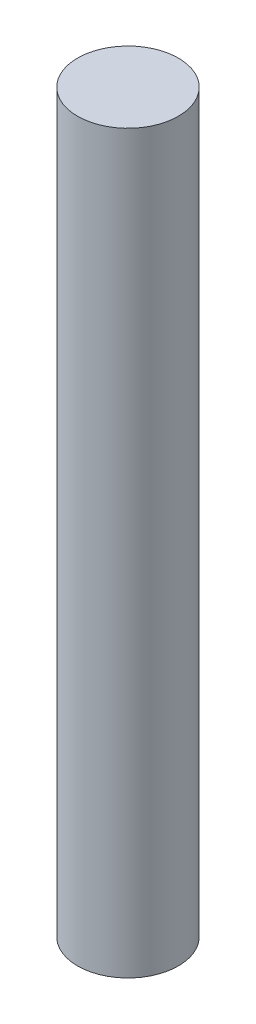
ISO-10303-21;
HEADER;
FILE_DESCRIPTION(('STEP AP214'),'2;1');
FILE_NAME('part.step','',(''),(''),'','','');
FILE_SCHEMA(('AUTOMOTIVE_DESIGN { 1 0 10303 214 1 1 1 1 }'));
ENDSEC;
DATA;
#1=APPLICATION_CONTEXT('core data for automotive mechanical design processes');
#2=APPLICATION_PROTOCOL_DEFINITION('international standard','automotive_design',2000,#1);
#3=PRODUCT_CONTEXT('',#1,'mechanical');
#4=PRODUCT('Part','Part','',(#3));
#5=PRODUCT_RELATED_PRODUCT_CATEGORY('part','',(#4));
#6=PRODUCT_DEFINITION_FORMATION('','',#4);
#7=PRODUCT_DEFINITION_CONTEXT('part definition',#1,'design');
#8=PRODUCT_DEFINITION('design','',#6,#7);
#9=PRODUCT_DEFINITION_SHAPE('','',#8);
#10=(LENGTH_UNIT() NAMED_UNIT(*) SI_UNIT(.MILLI.,.METRE.));
#11=(NAMED_UNIT(*) PLANE_ANGLE_UNIT() SI_UNIT($,.RADIAN.));
#12=(NAMED_UNIT(*) SI_UNIT($,.STERADIAN.) SOLID_ANGLE_UNIT());
#13=UNCERTAINTY_MEASURE_WITH_UNIT(LENGTH_MEASURE(1.E-05),#10,'distance_accuracy_value','');
#14=(GEOMETRIC_REPRESENTATION_CONTEXT(3) GLOBAL_UNCERTAINTY_ASSIGNED_CONTEXT((#13)) GLOBAL_UNIT_ASSIGNED_CONTEXT((#10,
#11,#12)) REPRESENTATION_CONTEXT('',''));
#15=CARTESIAN_POINT('',(0.,0.,0.));
#16=DIRECTION('',(0.,0.,1.));
#17=DIRECTION('',(1.,0.,0.));
#18=AXIS2_PLACEMENT_3D('',#15,#16,#17);
#19=CARTESIAN_POINT('',(0.,7.3,0.));
#20=DIRECTION('',(0.,-1.,0.));
#21=DIRECTION('',(0.,0.,-1.));
#22=AXIS2_PLACEMENT_3D('',#19,#20,#21);
#23=CYLINDRICAL_SURFACE('',#22,0.5);
#24=CARTESIAN_POINT('',(0.,7.3,0.));
#25=DIRECTION('',(0.,1.,0.));
#26=DIRECTION('',(0.,0.,1.));
#27=AXIS2_PLACEMENT_3D('',#24,#25,#26);
#28=CIRCLE('',#27,0.5);
#29=CARTESIAN_POINT('',(0.,7.3,0.5));
#30=VERTEX_POINT('',#29);
#31=EDGE_CURVE('E12',#30,#30,#28,.T.);
#32=ORIENTED_EDGE('',*,*,#31,.F.);
#33=EDGE_LOOP('',(#32));
#34=FACE_BOUND('',#33,.T.);
#35=CARTESIAN_POINT('',(0.,0.,0.));
#36=DIRECTION('',(0.,1.,0.));
#37=DIRECTION('',(0.,0.,1.));
#38=AXIS2_PLACEMENT_3D('',#35,#36,#37);
#39=CIRCLE('',#38,0.5);
#40=CARTESIAN_POINT('',(0.,0.,0.5));
#41=VERTEX_POINT('',#40);
#42=EDGE_CURVE('E48',#41,#41,#39,.T.);
#43=ORIENTED_EDGE('',*,*,#42,.T.);
#44=EDGE_LOOP('',(#43));
#45=FACE_BOUND('',#44,.T.);
#46=ADVANCED_FACE('F45',(#34,#45),#23,.T.);
#47=CARTESIAN_POINT('',(0.,7.3,0.));
#48=DIRECTION('',(0.,1.,0.));
#49=DIRECTION('',(0.,0.,1.));
#50=AXIS2_PLACEMENT_3D('',#47,#48,#49);
#51=PLANE('',#50);
#52=ORIENTED_EDGE('',*,*,#31,.T.);
#53=EDGE_LOOP('',(#52));
#54=FACE_BOUND('',#53,.T.);
#55=ADVANCED_FACE('F60',(#54),#51,.T.);
#56=CARTESIAN_POINT('',(0.,0.,0.));
#57=DIRECTION('',(0.,1.,0.));
#58=DIRECTION('',(0.,0.,1.));
#59=AXIS2_PLACEMENT_3D('',#56,#57,#58);
#60=PLANE('',#59);
#61=ORIENTED_EDGE('',*,*,#42,.F.);
#62=EDGE_LOOP('',(#61));
#63=FACE_BOUND('',#62,.T.);
#64=ADVANCED_FACE('F58',(#63),#60,.F.);
#65=CLOSED_SHELL('',(#46,#55,#64));
#66=MANIFOLD_SOLID_BREP('B2',#65);
#67=ADVANCED_BREP_SHAPE_REPRESENTATION('',(#18,#66),#14);
#68=SHAPE_DEFINITION_REPRESENTATION(#9,#67);
ENDSEC;
END-ISO-10303-21;
